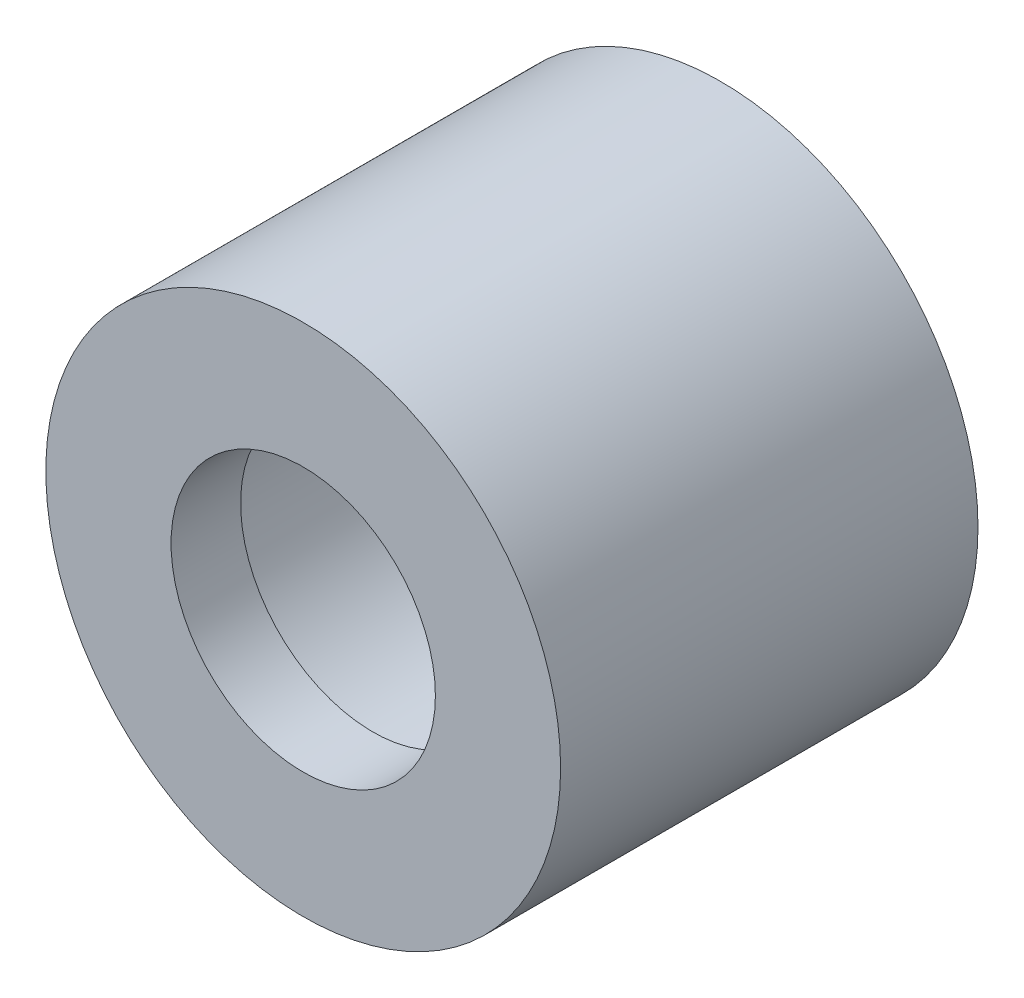
ISO-10303-21;
HEADER;
FILE_DESCRIPTION(('STEP AP214'),'2;1');
FILE_NAME('part.step','',(''),(''),'','','');
FILE_SCHEMA(('AUTOMOTIVE_DESIGN { 1 0 10303 214 1 1 1 1 }'));
ENDSEC;
DATA;
#1=APPLICATION_CONTEXT('core data for automotive mechanical design processes');
#2=APPLICATION_PROTOCOL_DEFINITION('international standard','automotive_design',2000,#1);
#3=PRODUCT_CONTEXT('',#1,'mechanical');
#4=PRODUCT('Part','Part','',(#3));
#5=PRODUCT_RELATED_PRODUCT_CATEGORY('part','',(#4));
#6=PRODUCT_DEFINITION_FORMATION('','',#4);
#7=PRODUCT_DEFINITION_CONTEXT('part definition',#1,'design');
#8=PRODUCT_DEFINITION('design','',#6,#7);
#9=PRODUCT_DEFINITION_SHAPE('','',#8);
#10=(LENGTH_UNIT() NAMED_UNIT(*) SI_UNIT(.MILLI.,.METRE.));
#11=(NAMED_UNIT(*) PLANE_ANGLE_UNIT() SI_UNIT($,.RADIAN.));
#12=(NAMED_UNIT(*) SI_UNIT($,.STERADIAN.) SOLID_ANGLE_UNIT());
#13=UNCERTAINTY_MEASURE_WITH_UNIT(LENGTH_MEASURE(1.E-05),#10,'distance_accuracy_value','');
#14=(GEOMETRIC_REPRESENTATION_CONTEXT(3) GLOBAL_UNCERTAINTY_ASSIGNED_CONTEXT((#13)) GLOBAL_UNIT_ASSIGNED_CONTEXT((#10,
#11,#12)) REPRESENTATION_CONTEXT('',''));
#15=CARTESIAN_POINT('',(0.,0.,0.));
#16=DIRECTION('',(0.,0.,1.));
#17=DIRECTION('',(1.,0.,0.));
#18=AXIS2_PLACEMENT_3D('',#15,#16,#17);
#19=CARTESIAN_POINT('',(0.,0.,-38.1));
#20=DIRECTION('',(0.,0.,1.));
#21=DIRECTION('',(1.,0.,0.));
#22=AXIS2_PLACEMENT_3D('',#19,#20,#21);
#23=CYLINDRICAL_SURFACE('',#22,12.065);
#24=CARTESIAN_POINT('',(0.,0.,0.));
#25=DIRECTION('',(0.,0.,1.));
#26=DIRECTION('',(1.,0.,0.));
#27=AXIS2_PLACEMENT_3D('',#24,#25,#26);
#28=CIRCLE('',#27,12.065);
#29=CARTESIAN_POINT('',(12.065,0.,0.));
#30=VERTEX_POINT('',#29);
#31=EDGE_CURVE('E55',#30,#30,#28,.T.);
#32=CARTESIAN_POINT('',(0.,0.,-6.35));
#33=DIRECTION('',(0.,0.,-1.));
#34=DIRECTION('',(-1.,0.,0.));
#35=AXIS2_PLACEMENT_3D('',#32,#33,#34);
#36=CIRCLE('',#35,12.065);
#37=CARTESIAN_POINT('',(12.065,0.,-6.34999999999999));
#38=VERTEX_POINT('',#37);
#39=EDGE_CURVE('E65',#38,#38,#36,.T.);
#40=CARTESIAN_POINT('',(12.065,0.,0.));
#41=CARTESIAN_POINT('',(12.065,0.,-0.0661458333333341));
#42=CARTESIAN_POINT('',(12.065,0.,-0.132291666666668));
#43=CARTESIAN_POINT('',(12.065,0.,-0.264583333333334));
#44=CARTESIAN_POINT('',(12.065,0.,-0.330729166666666));
#45=CARTESIAN_POINT('',(12.065,0.,-0.463020833333332));
#46=CARTESIAN_POINT('',(12.065,0.,-0.529166666666666));
#47=CARTESIAN_POINT('',(12.065,0.,-0.661458333333332));
#48=CARTESIAN_POINT('',(12.065,0.,-0.727604166666664));
#49=CARTESIAN_POINT('',(12.065,0.,-0.85989583333333));
#50=CARTESIAN_POINT('',(12.065,0.,-0.926041666666664));
#51=CARTESIAN_POINT('',(12.065,0.,-1.05833333333333));
#52=CARTESIAN_POINT('',(12.065,0.,-1.12447916666667));
#53=CARTESIAN_POINT('',(12.065,0.,-1.25677083333333));
#54=CARTESIAN_POINT('',(12.065,0.,-1.32291666666666));
#55=CARTESIAN_POINT('',(12.065,0.,-1.45520833333333));
#56=CARTESIAN_POINT('',(12.065,0.,-1.52135416666666));
#57=CARTESIAN_POINT('',(12.065,0.,-1.65364583333333));
#58=CARTESIAN_POINT('',(12.065,0.,-1.71979166666667));
#59=CARTESIAN_POINT('',(12.065,0.,-1.85208333333333));
#60=CARTESIAN_POINT('',(12.065,0.,-1.91822916666666));
#61=CARTESIAN_POINT('',(12.065,0.,-2.05052083333333));
#62=CARTESIAN_POINT('',(12.065,0.,-2.11666666666666));
#63=CARTESIAN_POINT('',(12.065,0.,-2.24895833333333));
#64=CARTESIAN_POINT('',(12.065,0.,-2.31510416666667));
#65=CARTESIAN_POINT('',(12.065,0.,-2.44739583333333));
#66=CARTESIAN_POINT('',(12.065,0.,-2.51354166666667));
#67=CARTESIAN_POINT('',(12.065,0.,-2.64583333333333));
#68=CARTESIAN_POINT('',(12.065,0.,-2.71197916666667));
#69=CARTESIAN_POINT('',(12.065,0.,-2.84427083333333));
#70=CARTESIAN_POINT('',(12.065,0.,-2.91041666666666));
#71=CARTESIAN_POINT('',(12.065,0.,-3.04270833333333));
#72=CARTESIAN_POINT('',(12.065,0.,-3.10885416666666));
#73=CARTESIAN_POINT('',(12.065,0.,-3.24114583333333));
#74=CARTESIAN_POINT('',(12.065,0.,-3.30729166666667));
#75=CARTESIAN_POINT('',(12.065,0.,-3.43958333333333));
#76=CARTESIAN_POINT('',(12.065,0.,-3.50572916666666));
#77=CARTESIAN_POINT('',(12.065,0.,-3.63802083333333));
#78=CARTESIAN_POINT('',(12.065,0.,-3.70416666666666));
#79=CARTESIAN_POINT('',(12.065,0.,-3.83645833333333));
#80=CARTESIAN_POINT('',(12.065,0.,-3.90260416666666));
#81=CARTESIAN_POINT('',(12.065,0.,-4.03489583333333));
#82=CARTESIAN_POINT('',(12.065,0.,-4.10104166666666));
#83=CARTESIAN_POINT('',(12.065,0.,-4.23333333333333));
#84=CARTESIAN_POINT('',(12.065,0.,-4.29947916666666));
#85=CARTESIAN_POINT('',(12.065,0.,-4.43177083333333));
#86=CARTESIAN_POINT('',(12.065,0.,-4.49791666666666));
#87=CARTESIAN_POINT('',(12.065,0.,-4.63020833333333));
#88=CARTESIAN_POINT('',(12.065,0.,-4.69635416666666));
#89=CARTESIAN_POINT('',(12.065,0.,-4.82864583333333));
#90=CARTESIAN_POINT('',(12.065,0.,-4.89479166666666));
#91=CARTESIAN_POINT('',(12.065,0.,-5.02708333333333));
#92=CARTESIAN_POINT('',(12.065,0.,-5.09322916666666));
#93=CARTESIAN_POINT('',(12.065,0.,-5.22552083333333));
#94=CARTESIAN_POINT('',(12.065,0.,-5.29166666666666));
#95=CARTESIAN_POINT('',(12.065,0.,-5.42395833333333));
#96=CARTESIAN_POINT('',(12.065,0.,-5.49010416666667));
#97=CARTESIAN_POINT('',(12.065,0.,-5.62239583333333));
#98=CARTESIAN_POINT('',(12.065,0.,-5.68854166666666));
#99=CARTESIAN_POINT('',(12.065,0.,-5.82083333333333));
#100=CARTESIAN_POINT('',(12.065,0.,-5.88697916666666));
#101=CARTESIAN_POINT('',(12.065,0.,-6.01927083333333));
#102=CARTESIAN_POINT('',(12.065,0.,-6.08541666666666));
#103=CARTESIAN_POINT('',(12.065,0.,-6.21770833333333));
#104=CARTESIAN_POINT('',(12.065,0.,-6.28385416666666));
#105=CARTESIAN_POINT('',(12.065,0.,-6.34999999999999));
#106=B_SPLINE_CURVE_WITH_KNOTS('',3,(#40,#41,#42,#43,#44,#45,#46,#47,#48,#49,#50,#51,#52,#53,
#54,#55,#56,#57,#58,#59,#60,#61,#62,#63,#64,#65,#66,#67,#68,#69,#70,#71,#72,#73,#74,#75,#76,#77,
#78,#79,#80,#81,#82,#83,#84,#85,#86,#87,#88,#89,#90,#91,#92,#93,#94,#95,#96,#97,#98,#99,#100,
#101,#102,#103,#104,#105),.UNSPECIFIED.,.F.,.F.,(4,2,2,2,2,2,2,2,2,2,2,2,2,2,2,2,2,2,2,2,2,2,2,
2,2,2,2,2,2,2,2,2,4),(0.,0.198437500000002,0.396874999999998,0.5953125,0.793749999999996,
0.992187499999998,1.190625,1.3890625,1.5875,1.7859375,1.984375,2.1828125,2.38125,2.5796875,
2.778125,2.97656249999999,3.175,3.3734375,3.571875,3.7703125,3.96874999999999,4.1671875,
4.365625,4.56406249999999,4.7625,4.9609375,5.15937499999999,5.3578125,5.55625,5.75468749999999,
5.953125,6.15156249999999,6.34999999999999),.UNSPECIFIED.);
#107=EDGE_CURVE('BSEAM42',#30,#38,#106,.T.);
#108=ORIENTED_EDGE('',*,*,#31,.T.);
#109=ORIENTED_EDGE('',*,*,#39,.T.);
#110=ORIENTED_EDGE('',*,*,#107,.T.);
#111=ORIENTED_EDGE('',*,*,#107,.F.);
#112=EDGE_LOOP('',(#108,#110,#109,#111));
#113=FACE_BOUND('',#112,.T.);
#114=ADVANCED_FACE('F42',(#113),#23,.F.);
#115=CARTESIAN_POINT('',(0.,0.,-38.1));
#116=DIRECTION('',(0.,0.,1.));
#117=DIRECTION('',(1.,0.,0.));
#118=AXIS2_PLACEMENT_3D('',#115,#116,#117);
#119=CYLINDRICAL_SURFACE('',#118,23.495);
#120=CARTESIAN_POINT('',(0.,0.,-38.1));
#121=DIRECTION('',(0.,0.,1.));
#122=DIRECTION('',(1.,0.,0.));
#123=AXIS2_PLACEMENT_3D('',#120,#121,#122);
#124=CIRCLE('',#123,23.495);
#125=CARTESIAN_POINT('',(23.495,0.,-38.1));
#126=VERTEX_POINT('',#125);
#127=EDGE_CURVE('E10',#126,#126,#124,.T.);
#128=CARTESIAN_POINT('',(0.,0.,0.));
#129=DIRECTION('',(0.,0.,1.));
#130=DIRECTION('',(1.,0.,0.));
#131=AXIS2_PLACEMENT_3D('',#128,#129,#130);
#132=CIRCLE('',#131,23.495);
#133=CARTESIAN_POINT('',(23.495,0.,0.));
#134=VERTEX_POINT('',#133);
#135=EDGE_CURVE('E46',#134,#134,#132,.T.);
#136=CARTESIAN_POINT('',(23.495,0.,-38.1));
#137=CARTESIAN_POINT('',(23.495,0.,-37.703125));
#138=CARTESIAN_POINT('',(23.495,0.,-37.30625));
#139=CARTESIAN_POINT('',(23.495,0.,-36.5125));
#140=CARTESIAN_POINT('',(23.495,0.,-36.115625));
#141=CARTESIAN_POINT('',(23.495,0.,-35.321875));
#142=CARTESIAN_POINT('',(23.495,0.,-34.925));
#143=CARTESIAN_POINT('',(23.495,0.,-34.13125));
#144=CARTESIAN_POINT('',(23.495,0.,-33.734375));
#145=CARTESIAN_POINT('',(23.495,0.,-32.940625));
#146=CARTESIAN_POINT('',(23.495,0.,-32.54375));
#147=CARTESIAN_POINT('',(23.495,0.,-31.75));
#148=CARTESIAN_POINT('',(23.495,0.,-31.353125));
#149=CARTESIAN_POINT('',(23.495,0.,-30.559375));
#150=CARTESIAN_POINT('',(23.495,0.,-30.1625));
#151=CARTESIAN_POINT('',(23.495,0.,-29.36875));
#152=CARTESIAN_POINT('',(23.495,0.,-28.971875));
#153=CARTESIAN_POINT('',(23.495,0.,-28.178125));
#154=CARTESIAN_POINT('',(23.495,0.,-27.78125));
#155=CARTESIAN_POINT('',(23.495,0.,-26.9875));
#156=CARTESIAN_POINT('',(23.495,0.,-26.590625));
#157=CARTESIAN_POINT('',(23.495,0.,-25.796875));
#158=CARTESIAN_POINT('',(23.495,0.,-25.4));
#159=CARTESIAN_POINT('',(23.495,0.,-24.60625));
#160=CARTESIAN_POINT('',(23.495,0.,-24.209375));
#161=CARTESIAN_POINT('',(23.495,0.,-23.415625));
#162=CARTESIAN_POINT('',(23.495,0.,-23.01875));
#163=CARTESIAN_POINT('',(23.495,0.,-22.225));
#164=CARTESIAN_POINT('',(23.495,0.,-21.828125));
#165=CARTESIAN_POINT('',(23.495,0.,-21.034375));
#166=CARTESIAN_POINT('',(23.495,0.,-20.6375));
#167=CARTESIAN_POINT('',(23.495,0.,-19.84375));
#168=CARTESIAN_POINT('',(23.495,0.,-19.446875));
#169=CARTESIAN_POINT('',(23.495,0.,-18.653125));
#170=CARTESIAN_POINT('',(23.495,0.,-18.25625));
#171=CARTESIAN_POINT('',(23.495,0.,-17.4625));
#172=CARTESIAN_POINT('',(23.495,0.,-17.065625));
#173=CARTESIAN_POINT('',(23.495,0.,-16.271875));
#174=CARTESIAN_POINT('',(23.495,0.,-15.875));
#175=CARTESIAN_POINT('',(23.495,0.,-15.08125));
#176=CARTESIAN_POINT('',(23.495,0.,-14.684375));
#177=CARTESIAN_POINT('',(23.495,0.,-13.890625));
#178=CARTESIAN_POINT('',(23.495,0.,-13.49375));
#179=CARTESIAN_POINT('',(23.495,0.,-12.7));
#180=CARTESIAN_POINT('',(23.495,0.,-12.303125));
#181=CARTESIAN_POINT('',(23.495,0.,-11.509375));
#182=CARTESIAN_POINT('',(23.495,0.,-11.1125));
#183=CARTESIAN_POINT('',(23.495,0.,-10.31875));
#184=CARTESIAN_POINT('',(23.495,0.,-9.921875));
#185=CARTESIAN_POINT('',(23.495,0.,-9.128125));
#186=CARTESIAN_POINT('',(23.495,0.,-8.73125));
#187=CARTESIAN_POINT('',(23.495,0.,-7.9375));
#188=CARTESIAN_POINT('',(23.495,0.,-7.540625));
#189=CARTESIAN_POINT('',(23.495,0.,-6.746875));
#190=CARTESIAN_POINT('',(23.495,0.,-6.35));
#191=CARTESIAN_POINT('',(23.495,0.,-5.55625));
#192=CARTESIAN_POINT('',(23.495,0.,-5.159375));
#193=CARTESIAN_POINT('',(23.495,0.,-4.365625));
#194=CARTESIAN_POINT('',(23.495,0.,-3.96875));
#195=CARTESIAN_POINT('',(23.495,0.,-3.175));
#196=CARTESIAN_POINT('',(23.495,0.,-2.778125));
#197=CARTESIAN_POINT('',(23.495,0.,-1.984375));
#198=CARTESIAN_POINT('',(23.495,0.,-1.5875));
#199=CARTESIAN_POINT('',(23.495,0.,-0.79375));
#200=CARTESIAN_POINT('',(23.495,0.,-0.396875));
#201=CARTESIAN_POINT('',(23.495,0.,0.));
#202=B_SPLINE_CURVE_WITH_KNOTS('',3,(#136,#137,#138,#139,#140,#141,#142,#143,#144,#145,#146,
#147,#148,#149,#150,#151,#152,#153,#154,#155,#156,#157,#158,#159,#160,#161,#162,#163,#164,#165,
#166,#167,#168,#169,#170,#171,#172,#173,#174,#175,#176,#177,#178,#179,#180,#181,#182,#183,#184,
#185,#186,#187,#188,#189,#190,#191,#192,#193,#194,#195,#196,#197,#198,#199,#200,#201),
.UNSPECIFIED.,.F.,.F.,(4,2,2,2,2,2,2,2,2,2,2,2,2,2,2,2,2,2,2,2,2,2,2,2,2,2,2,2,2,2,2,2,4),(0.,
1.190625,2.38125,3.571875,4.7625,5.953125,7.14375,8.334375,9.52500000000001,10.715625,11.90625,
13.096875,14.2875,15.478125,16.66875,17.859375,19.05,20.240625,21.43125,22.621875,23.8125,
25.003125,26.19375,27.384375,28.575,29.765625,30.95625,32.146875,33.3375,34.528125,35.71875,
36.909375,38.1),.UNSPECIFIED.);
#203=EDGE_CURVE('BSEAM44',#126,#134,#202,.T.);
#204=ORIENTED_EDGE('',*,*,#127,.T.);
#205=ORIENTED_EDGE('',*,*,#135,.F.);
#206=ORIENTED_EDGE('',*,*,#203,.T.);
#207=ORIENTED_EDGE('',*,*,#203,.F.);
#208=EDGE_LOOP('',(#204,#206,#205,#207));
#209=FACE_BOUND('',#208,.T.);
#210=ADVANCED_FACE('F44',(#209),#119,.T.);
#211=CARTESIAN_POINT('',(0.,0.,-38.1));
#212=DIRECTION('',(0.,0.,1.));
#213=DIRECTION('',(1.,0.,0.));
#214=AXIS2_PLACEMENT_3D('',#211,#212,#213);
#215=PLANE('',#214);
#216=CARTESIAN_POINT('',(0.,19.3675,-38.1));
#217=DIRECTION('',(0.,0.,-1.));
#218=DIRECTION('',(-1.,0.,0.));
#219=AXIS2_PLACEMENT_3D('',#216,#217,#218);
#220=CIRCLE('',#219,2.54);
#221=CARTESIAN_POINT('',(-2.54,19.3675,-38.1));
#222=VERTEX_POINT('',#221);
#223=EDGE_CURVE('E81',#222,#222,#220,.T.);
#224=ORIENTED_EDGE('',*,*,#223,.F.);
#225=EDGE_LOOP('',(#224));
#226=FACE_BOUND('',#225,.T.);
#227=CARTESIAN_POINT('',(0.,-19.3675,-38.1));
#228=DIRECTION('',(0.,0.,-1.));
#229=DIRECTION('',(-1.,0.,0.));
#230=AXIS2_PLACEMENT_3D('',#227,#228,#229);
#231=CIRCLE('',#230,2.54);
#232=CARTESIAN_POINT('',(-2.54,-19.3675,-38.1));
#233=VERTEX_POINT('',#232);
#234=EDGE_CURVE('E77',#233,#233,#231,.T.);
#235=ORIENTED_EDGE('',*,*,#234,.F.);
#236=EDGE_LOOP('',(#235));
#237=FACE_BOUND('',#236,.T.);
#238=CARTESIAN_POINT('',(0.,0.,-38.1));
#239=DIRECTION('',(0.,0.,-1.));
#240=DIRECTION('',(-1.,0.,0.));
#241=AXIS2_PLACEMENT_3D('',#238,#239,#240);
#242=CIRCLE('',#241,15.24);
#243=CARTESIAN_POINT('',(-15.24,0.,-38.1));
#244=VERTEX_POINT('',#243);
#245=EDGE_CURVE('E61',#244,#244,#242,.T.);
#246=ORIENTED_EDGE('',*,*,#245,.F.);
#247=EDGE_LOOP('',(#246));
#248=FACE_BOUND('',#247,.T.);
#249=ORIENTED_EDGE('',*,*,#127,.F.);
#250=EDGE_LOOP('',(#249));
#251=FACE_BOUND('',#250,.T.);
#252=ADVANCED_FACE('F98',(#226,#237,#248,#251),#215,.F.);
#253=CARTESIAN_POINT('',(0.,0.,0.));
#254=DIRECTION('',(0.,0.,1.));
#255=DIRECTION('',(1.,0.,0.));
#256=AXIS2_PLACEMENT_3D('',#253,#254,#255);
#257=PLANE('',#256);
#258=ORIENTED_EDGE('',*,*,#31,.F.);
#259=EDGE_LOOP('',(#258));
#260=FACE_BOUND('',#259,.T.);
#261=ORIENTED_EDGE('',*,*,#135,.T.);
#262=EDGE_LOOP('',(#261));
#263=FACE_BOUND('',#262,.T.);
#264=ADVANCED_FACE('F101',(#260,#263),#257,.T.);
#265=CARTESIAN_POINT('',(0.,0.,-6.35));
#266=DIRECTION('',(0.,0.,-1.));
#267=DIRECTION('',(-1.,0.,0.));
#268=AXIS2_PLACEMENT_3D('',#265,#266,#267);
#269=CYLINDRICAL_SURFACE('',#268,15.24);
#270=CARTESIAN_POINT('',(0.,0.,-6.35));
#271=DIRECTION('',(0.,0.,-1.));
#272=DIRECTION('',(-1.,0.,0.));
#273=AXIS2_PLACEMENT_3D('',#270,#271,#272);
#274=CIRCLE('',#273,15.24);
#275=CARTESIAN_POINT('',(-15.24,0.,-6.35));
#276=VERTEX_POINT('',#275);
#277=EDGE_CURVE('E60',#276,#276,#274,.T.);
#278=ORIENTED_EDGE('',*,*,#277,.F.);
#279=EDGE_LOOP('',(#278));
#280=FACE_BOUND('',#279,.T.);
#281=ORIENTED_EDGE('',*,*,#245,.T.);
#282=EDGE_LOOP('',(#281));
#283=FACE_BOUND('',#282,.T.);
#284=ADVANCED_FACE('F108',(#280,#283),#269,.F.);
#285=CARTESIAN_POINT('',(0.,0.,-6.35));
#286=DIRECTION('',(0.,0.,-1.));
#287=DIRECTION('',(-1.,0.,0.));
#288=AXIS2_PLACEMENT_3D('',#285,#286,#287);
#289=PLANE('',#288);
#290=ORIENTED_EDGE('',*,*,#39,.F.);
#291=EDGE_LOOP('',(#290));
#292=FACE_BOUND('',#291,.T.);
#293=ORIENTED_EDGE('',*,*,#277,.T.);
#294=EDGE_LOOP('',(#293));
#295=FACE_BOUND('',#294,.T.);
#296=ADVANCED_FACE('F110',(#292,#295),#289,.T.);
#297=CARTESIAN_POINT('',(0.,-19.3675,-33.02));
#298=DIRECTION('',(0.,0.,-1.));
#299=DIRECTION('',(-1.,0.,0.));
#300=AXIS2_PLACEMENT_3D('',#297,#298,#299);
#301=CYLINDRICAL_SURFACE('',#300,2.54);
#302=CARTESIAN_POINT('',(0.,-19.3675,-33.02));
#303=DIRECTION('',(0.,0.,-1.));
#304=DIRECTION('',(-1.,0.,0.));
#305=AXIS2_PLACEMENT_3D('',#302,#303,#304);
#306=CIRCLE('',#305,2.54);
#307=CARTESIAN_POINT('',(-2.54,-19.3675,-33.02));
#308=VERTEX_POINT('',#307);
#309=EDGE_CURVE('E73',#308,#308,#306,.T.);
#310=ORIENTED_EDGE('',*,*,#309,.F.);
#311=EDGE_LOOP('',(#310));
#312=FACE_BOUND('',#311,.T.);
#313=ORIENTED_EDGE('',*,*,#234,.T.);
#314=EDGE_LOOP('',(#313));
#315=FACE_BOUND('',#314,.T.);
#316=ADVANCED_FACE('F117',(#312,#315),#301,.F.);
#317=CARTESIAN_POINT('',(0.,-19.3675,-33.02));
#318=DIRECTION('',(0.,0.,-1.));
#319=DIRECTION('',(-1.,0.,0.));
#320=AXIS2_PLACEMENT_3D('',#317,#318,#319);
#321=PLANE('',#320);
#322=ORIENTED_EDGE('',*,*,#309,.T.);
#323=EDGE_LOOP('',(#322));
#324=FACE_BOUND('',#323,.T.);
#325=ADVANCED_FACE('F94',(#324),#321,.T.);
#326=CARTESIAN_POINT('',(0.,19.3675,-33.02));
#327=DIRECTION('',(0.,0.,-1.));
#328=DIRECTION('',(-1.,0.,0.));
#329=AXIS2_PLACEMENT_3D('',#326,#327,#328);
#330=CYLINDRICAL_SURFACE('',#329,2.54);
#331=CARTESIAN_POINT('',(0.,19.3675,-33.02));
#332=DIRECTION('',(0.,0.,-1.));
#333=DIRECTION('',(-1.,0.,0.));
#334=AXIS2_PLACEMENT_3D('',#331,#332,#333);
#335=CIRCLE('',#334,2.54);
#336=CARTESIAN_POINT('',(-2.54,19.3675,-33.02));
#337=VERTEX_POINT('',#336);
#338=EDGE_CURVE('E72',#337,#337,#335,.T.);
#339=ORIENTED_EDGE('',*,*,#338,.F.);
#340=EDGE_LOOP('',(#339));
#341=FACE_BOUND('',#340,.T.);
#342=ORIENTED_EDGE('',*,*,#223,.T.);
#343=EDGE_LOOP('',(#342));
#344=FACE_BOUND('',#343,.T.);
#345=ADVANCED_FACE('F91',(#341,#344),#330,.F.);
#346=CARTESIAN_POINT('',(0.,19.3675,-33.02));
#347=DIRECTION('',(0.,0.,-1.));
#348=DIRECTION('',(-1.,0.,0.));
#349=AXIS2_PLACEMENT_3D('',#346,#347,#348);
#350=PLANE('',#349);
#351=ORIENTED_EDGE('',*,*,#338,.T.);
#352=EDGE_LOOP('',(#351));
#353=FACE_BOUND('',#352,.T.);
#354=ADVANCED_FACE('F89',(#353),#350,.T.);
#355=CLOSED_SHELL('',(#114,#210,#252,#264,#284,#296,#316,#325,#345,#354));
#356=MANIFOLD_SOLID_BREP('B2',#355);
#357=ADVANCED_BREP_SHAPE_REPRESENTATION('',(#18,#356),#14);
#358=SHAPE_DEFINITION_REPRESENTATION(#9,#357);
ENDSEC;
END-ISO-10303-21;
